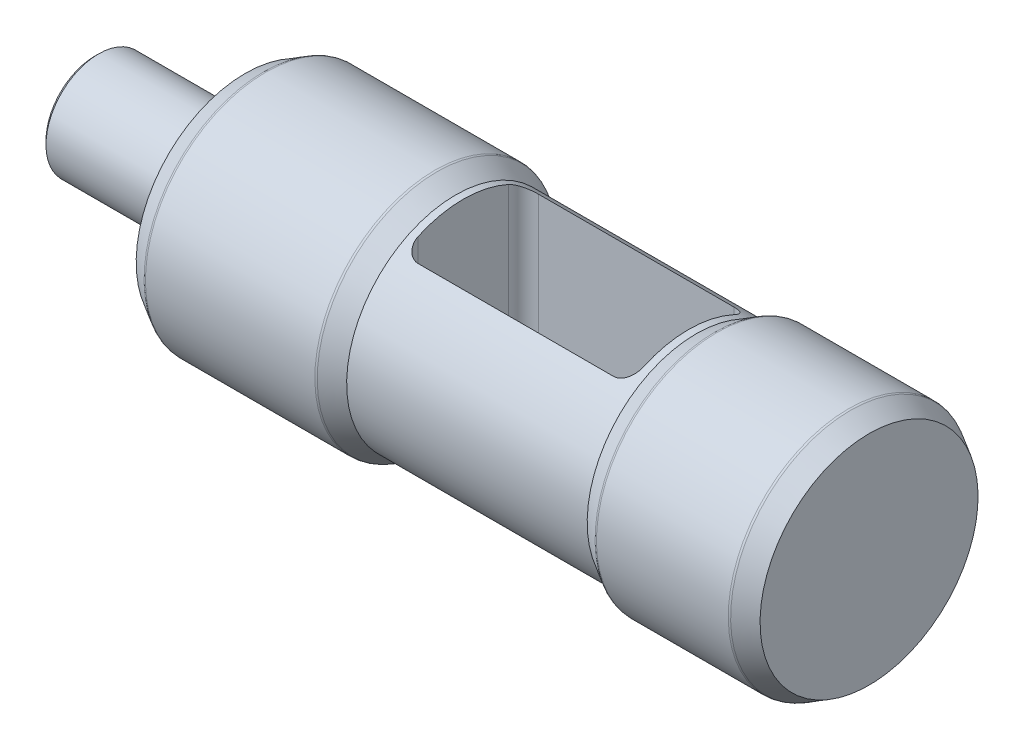
ISO-10303-21;
HEADER;
FILE_DESCRIPTION(('STEP AP214'),'2;1');
FILE_NAME('part.step','',(''),(''),'','','');
FILE_SCHEMA(('AUTOMOTIVE_DESIGN { 1 0 10303 214 1 1 1 1 }'));
ENDSEC;
DATA;
#1=APPLICATION_CONTEXT('core data for automotive mechanical design processes');
#2=APPLICATION_PROTOCOL_DEFINITION('international standard','automotive_design',2000,#1);
#3=PRODUCT_CONTEXT('',#1,'mechanical');
#4=PRODUCT('Part','Part','',(#3));
#5=PRODUCT_RELATED_PRODUCT_CATEGORY('part','',(#4));
#6=PRODUCT_DEFINITION_FORMATION('','',#4);
#7=PRODUCT_DEFINITION_CONTEXT('part definition',#1,'design');
#8=PRODUCT_DEFINITION('design','',#6,#7);
#9=PRODUCT_DEFINITION_SHAPE('','',#8);
#10=(LENGTH_UNIT() NAMED_UNIT(*) SI_UNIT(.MILLI.,.METRE.));
#11=(NAMED_UNIT(*) PLANE_ANGLE_UNIT() SI_UNIT($,.RADIAN.));
#12=(NAMED_UNIT(*) SI_UNIT($,.STERADIAN.) SOLID_ANGLE_UNIT());
#13=UNCERTAINTY_MEASURE_WITH_UNIT(LENGTH_MEASURE(1.E-05),#10,'distance_accuracy_value','');
#14=(GEOMETRIC_REPRESENTATION_CONTEXT(3) GLOBAL_UNCERTAINTY_ASSIGNED_CONTEXT((#13)) GLOBAL_UNIT_ASSIGNED_CONTEXT((#10,
#11,#12)) REPRESENTATION_CONTEXT('',''));
#15=CARTESIAN_POINT('',(0.,0.,0.));
#16=DIRECTION('',(0.,0.,1.));
#17=DIRECTION('',(1.,0.,0.));
#18=AXIS2_PLACEMENT_3D('',#15,#16,#17);
#19=CARTESIAN_POINT('',(0.,0.,0.));
#20=DIRECTION('',(1.,0.,0.));
#21=DIRECTION('',(0.,1.,0.));
#22=AXIS2_PLACEMENT_3D('',#19,#20,#21);
#23=PLANE('',#22);
#24=CARTESIAN_POINT('',(0.,0.,0.));
#25=DIRECTION('',(1.,0.,0.));
#26=DIRECTION('',(0.,1.,0.));
#27=AXIS2_PLACEMENT_3D('',#24,#25,#26);
#28=CIRCLE('',#27,14.5);
#29=CARTESIAN_POINT('',(0.,14.5,0.));
#30=VERTEX_POINT('',#29);
#31=EDGE_CURVE('E110',#30,#30,#28,.T.);
#32=ORIENTED_EDGE('',*,*,#31,.T.);
#33=EDGE_LOOP('',(#32));
#34=FACE_BOUND('',#33,.T.);
#35=ADVANCED_FACE('F38',(#34),#23,.T.);
#36=CARTESIAN_POINT('',(0.,0.,0.));
#37=DIRECTION('',(-1.,0.,0.));
#38=DIRECTION('',(0.,-1.,0.));
#39=AXIS2_PLACEMENT_3D('',#36,#37,#38);
#40=CONICAL_SURFACE('',#39,14.5,0.5235987755983);
#41=CARTESIAN_POINT('',(-2.48205080756886,0.,0.));
#42=DIRECTION('',(1.,0.,0.));
#43=DIRECTION('',(0.,1.,0.));
#44=AXIS2_PLACEMENT_3D('',#41,#42,#43);
#45=CIRCLE('',#44,15.9330127018922);
#46=CARTESIAN_POINT('',(-2.48205080756886,15.9330127018922,0.));
#47=VERTEX_POINT('',#46);
#48=EDGE_CURVE('E221',#47,#47,#45,.T.);
#49=ORIENTED_EDGE('',*,*,#48,.T.);
#50=EDGE_LOOP('',(#49));
#51=FACE_BOUND('',#50,.T.);
#52=ORIENTED_EDGE('',*,*,#31,.F.);
#53=EDGE_LOOP('',(#52));
#54=FACE_BOUND('',#53,.T.);
#55=ADVANCED_FACE('F211',(#51,#54),#40,.T.);
#56=CARTESIAN_POINT('',(-2.73205080756886,0.,0.));
#57=DIRECTION('',(1.,0.,0.));
#58=DIRECTION('',(0.,1.,0.));
#59=AXIS2_PLACEMENT_3D('',#56,#57,#58);
#60=TOROIDAL_SURFACE('',#59,15.5,0.5);
#61=CARTESIAN_POINT('',(-2.73205080756886,0.,0.));
#62=DIRECTION('',(1.,0.,0.));
#63=DIRECTION('',(0.,1.,0.));
#64=AXIS2_PLACEMENT_3D('',#61,#62,#63);
#65=CIRCLE('',#64,16.);
#66=CARTESIAN_POINT('',(-2.73205080756886,16.,0.));
#67=VERTEX_POINT('',#66);
#68=EDGE_CURVE('E223',#67,#67,#65,.T.);
#69=ORIENTED_EDGE('',*,*,#68,.T.);
#70=EDGE_LOOP('',(#69));
#71=FACE_BOUND('',#70,.T.);
#72=ORIENTED_EDGE('',*,*,#48,.F.);
#73=EDGE_LOOP('',(#72));
#74=FACE_BOUND('',#73,.T.);
#75=ADVANCED_FACE('F216',(#71,#74),#60,.T.);
#76=CARTESIAN_POINT('',(0.,0.,0.));
#77=DIRECTION('',(1.,0.,0.));
#78=DIRECTION('',(0.,1.,0.));
#79=AXIS2_PLACEMENT_3D('',#76,#77,#78);
#80=CYLINDRICAL_SURFACE('',#79,16.);
#81=CARTESIAN_POINT('',(-20.2679491924311,0.,0.));
#82=DIRECTION('',(1.,0.,0.));
#83=DIRECTION('',(0.,1.,0.));
#84=AXIS2_PLACEMENT_3D('',#81,#82,#83);
#85=CIRCLE('',#84,16.);
#86=CARTESIAN_POINT('',(-20.2679491924311,16.,0.));
#87=VERTEX_POINT('',#86);
#88=EDGE_CURVE('E228',#87,#87,#85,.T.);
#89=ORIENTED_EDGE('',*,*,#88,.T.);
#90=EDGE_LOOP('',(#89));
#91=FACE_BOUND('',#90,.T.);
#92=ORIENTED_EDGE('',*,*,#68,.F.);
#93=EDGE_LOOP('',(#92));
#94=FACE_BOUND('',#93,.T.);
#95=ADVANCED_FACE('F443',(#91,#94),#80,.T.);
#96=CARTESIAN_POINT('',(-20.2679491924311,0.,0.));
#97=DIRECTION('',(1.,0.,0.));
#98=DIRECTION('',(0.,1.,0.));
#99=AXIS2_PLACEMENT_3D('',#96,#97,#98);
#100=TOROIDAL_SURFACE('',#99,15.5,0.500000000000001);
#101=CARTESIAN_POINT('',(-20.5179491924311,0.,0.));
#102=DIRECTION('',(1.,0.,0.));
#103=DIRECTION('',(0.,1.,0.));
#104=AXIS2_PLACEMENT_3D('',#101,#102,#103);
#105=CIRCLE('',#104,15.9330127018922);
#106=CARTESIAN_POINT('',(-20.5179491924311,15.9330127018922,0.));
#107=VERTEX_POINT('',#106);
#108=EDGE_CURVE('E231',#107,#107,#105,.T.);
#109=ORIENTED_EDGE('',*,*,#108,.T.);
#110=EDGE_LOOP('',(#109));
#111=FACE_BOUND('',#110,.T.);
#112=ORIENTED_EDGE('',*,*,#88,.F.);
#113=EDGE_LOOP('',(#112));
#114=FACE_BOUND('',#113,.T.);
#115=ADVANCED_FACE('F435',(#111,#114),#100,.T.);
#116=CARTESIAN_POINT('',(-20.5179491924311,0.,0.));
#117=DIRECTION('',(1.,0.,0.));
#118=DIRECTION('',(0.,1.,0.));
#119=AXIS2_PLACEMENT_3D('',#116,#117,#118);
#120=CONICAL_SURFACE('',#119,15.9330127018922,0.523598775598302);
#121=CARTESIAN_POINT('',(-23.,0.,0.));
#122=DIRECTION('',(1.,0.,0.));
#123=DIRECTION('',(0.,1.,0.));
#124=AXIS2_PLACEMENT_3D('',#121,#122,#123);
#125=CIRCLE('',#124,14.5);
#126=CARTESIAN_POINT('',(-23.,14.5,0.));
#127=VERTEX_POINT('',#126);
#128=EDGE_CURVE('E234',#127,#127,#125,.T.);
#129=ORIENTED_EDGE('',*,*,#128,.T.);
#130=EDGE_LOOP('',(#129));
#131=FACE_BOUND('',#130,.T.);
#132=ORIENTED_EDGE('',*,*,#108,.F.);
#133=EDGE_LOOP('',(#132));
#134=FACE_BOUND('',#133,.T.);
#135=ADVANCED_FACE('F429',(#131,#134),#120,.T.);
#136=CARTESIAN_POINT('',(0.,0.,0.));
#137=DIRECTION('',(1.,0.,0.));
#138=DIRECTION('',(0.,1.,0.));
#139=AXIS2_PLACEMENT_3D('',#136,#137,#138);
#140=CYLINDRICAL_SURFACE('',#139,14.5);
#141=CARTESIAN_POINT('',(-54.,-13.2003787824441,-5.99999999999999));
#142=CARTESIAN_POINT('',(-53.9999962018204,-13.1718690497998,-6.06272982179049));
#143=CARTESIAN_POINT('',(-53.9970479102192,-13.142923474746,-6.12521694248615));
#144=CARTESIAN_POINT('',(-53.9853787268924,-13.0843682319811,-6.24932020988054));
#145=CARTESIAN_POINT('',(-53.9766590541952,-13.0547587057851,-6.31093653770132));
#146=CARTESIAN_POINT('',(-53.9420315265456,-12.9652683061369,-6.49385660622234));
#147=CARTESIAN_POINT('',(-53.9076548315793,-12.9046856621707,-6.61331913443249));
#148=CARTESIAN_POINT('',(-53.8174613132875,-12.7838925232096,-6.84390757771409));
#149=CARTESIAN_POINT('',(-53.7616525929328,-12.7236818962946,-6.95503662453213));
#150=CARTESIAN_POINT('',(-53.629572397776,-12.6059651757635,-7.16618779818155));
#151=CARTESIAN_POINT('',(-53.5532909196575,-12.5484604204666,-7.26620446145423));
#152=CARTESIAN_POINT('',(-53.3822461974614,-12.4396771379762,-7.4508938332366));
#153=CARTESIAN_POINT('',(-53.2876716094292,-12.3883430632501,-7.5357074466829));
#154=CARTESIAN_POINT('',(-53.081214344984,-12.2947928401368,-7.68739348291283));
#155=CARTESIAN_POINT('',(-52.9693641445728,-12.252559932362,-7.7542989387417));
#156=CARTESIAN_POINT('',(-52.7634649072883,-12.1907097352283,-7.85104865878145));
#157=CARTESIAN_POINT('',(-52.6727096404612,-12.1680648347409,-7.88602074835405));
#158=CARTESIAN_POINT('',(-52.4855767241566,-12.1312070891522,-7.94260470994349));
#159=CARTESIAN_POINT('',(-52.3892115624562,-12.1169762473417,-7.96424510113034));
#160=CARTESIAN_POINT('',(-52.2433217336691,-12.102809159477,-7.98574197090867));
#161=CARTESIAN_POINT('',(-52.1948798830837,-12.0992837574165,-7.9910800331155));
#162=CARTESIAN_POINT('',(-52.0976343705149,-12.0945708851097,-7.99821005557988));
#163=CARTESIAN_POINT('',(-52.0488307917392,-12.0933828929796,-8.00000280741475));
#164=CARTESIAN_POINT('',(-52.,-12.0933866224478,-8.));
#165=B_SPLINE_CURVE_WITH_KNOTS('',3,(#141,#142,#143,#144,#145,#146,#147,#148,#149,#150,#151,
#152,#153,#154,#155,#156,#157,#158,#159,#160,#161,#162,#163,#164),.UNSPECIFIED.,.F.,.F.,(4,2,2,
2,2,2,2,2,2,2,2,4),(0.,0.206572813845276,0.413102009394413,0.825874975162324,1.23849203407839,
1.65131107249231,2.0600801724595,2.46808998575935,2.76645413034276,3.06417777766503,
3.21060297753782,3.35699548070823),.UNSPECIFIED.);
#166=CARTESIAN_POINT('',(-54.,-13.2003787824441,-5.99999999999999));
#167=VERTEX_POINT('',#166);
#168=CARTESIAN_POINT('',(-52.,-12.0933866224478,-8.));
#169=VERTEX_POINT('',#168);
#170=EDGE_CURVE('E11',#167,#169,#165,.T.);
#171=ORIENTED_EDGE('',*,*,#170,.F.);
#172=CARTESIAN_POINT('',(-54.,0.,0.));
#173=DIRECTION('',(-1.,0.,0.));
#174=DIRECTION('',(0.,0.,1.));
#175=AXIS2_PLACEMENT_3D('',#172,#173,#174);
#176=CIRCLE('',#175,14.5);
#177=CARTESIAN_POINT('',(-54.,-13.2003787824441,5.99999999999999));
#178=VERTEX_POINT('',#177);
#179=EDGE_CURVE('E112',#178,#167,#176,.F.);
#180=ORIENTED_EDGE('',*,*,#179,.F.);
#181=CARTESIAN_POINT('',(-52.,-12.0933866224478,8.));
#182=CARTESIAN_POINT('',(-52.0501328052735,-12.0933776880823,8.00000957600883));
#183=CARTESIAN_POINT('',(-52.1002589200244,-12.0946333131581,7.9981153229367));
#184=CARTESIAN_POINT('',(-52.2000829597053,-12.0996057417331,7.99059308530951));
#185=CARTESIAN_POINT('',(-52.2497810860355,-12.1033213153915,7.98496696648209));
#186=CARTESIAN_POINT('',(-52.3481090721925,-12.1131183125209,7.97009654958254));
#187=CARTESIAN_POINT('',(-52.396743356241,-12.1191863685354,7.96087269307811));
#188=CARTESIAN_POINT('',(-52.4928729126603,-12.1335614661929,7.93894562252112));
#189=CARTESIAN_POINT('',(-52.5403680923875,-12.14186868928,7.92624212650517));
#190=CARTESIAN_POINT('',(-52.6805063279257,-12.169897488175,7.88319574438101));
#191=CARTESIAN_POINT('',(-52.7710568912971,-12.1927526897363,7.8478773935867));
#192=CARTESIAN_POINT('',(-52.9445221688712,-12.2453565447377,7.76554045809219));
#193=CARTESIAN_POINT('',(-53.0274268336699,-12.275114094792,7.71850676736153));
#194=CARTESIAN_POINT('',(-53.1901025060887,-12.3423609056927,7.61054876246997));
#195=CARTESIAN_POINT('',(-53.2691939250455,-12.3802579944522,7.5488569415412));
#196=CARTESIAN_POINT('',(-53.4161403846064,-12.4604366082477,7.41576439289835));
#197=CARTESIAN_POINT('',(-53.4839913489786,-12.5027197148272,7.34436016010052));
#198=CARTESIAN_POINT('',(-53.6175087204539,-12.59696271259,7.18168954090559));
#199=CARTESIAN_POINT('',(-53.6811826804918,-12.6494031149878,7.08906239698574));
#200=CARTESIAN_POINT('',(-53.7919043541106,-12.7560648636545,6.89529303359034));
#201=CARTESIAN_POINT('',(-53.8389439190489,-12.8102870685953,6.79414667078557));
#202=CARTESIAN_POINT('',(-53.9175898698882,-12.9216043721237,6.58007459168697));
#203=CARTESIAN_POINT('',(-53.9482833389689,-12.9787044984349,6.46681096196));
#204=CARTESIAN_POINT('',(-53.97918560982,-13.0630501463674,6.29371688567636));
#205=CARTESIAN_POINT('',(-53.9869634399935,-13.0909564136923,6.23546714305457));
#206=CARTESIAN_POINT('',(-53.9973693490221,-13.1461641741954,6.11821665000863));
#207=CARTESIAN_POINT('',(-53.9999966957702,-13.1734655808514,6.05921579401821));
#208=CARTESIAN_POINT('',(-54.,-13.2003787824441,5.99999999999999));
#209=B_SPLINE_CURVE_WITH_KNOTS('',3,(#181,#182,#183,#184,#185,#186,#187,#188,#189,#190,#191,
#192,#193,#194,#195,#196,#197,#198,#199,#200,#201,#202,#203,#204,#205,#206,#207,#208),
.UNSPECIFIED.,.F.,.F.,(4,2,2,2,2,2,2,2,2,2,2,2,2,4),(0.,0.150335895730353,0.300596688372729,
0.450015884698434,0.599447192397797,0.89754210739345,1.19602340086841,1.51647019754078,
1.83703294767077,2.20760945825579,2.57836725141614,2.96809734555003,3.16308370039876,
3.35809776924836),.UNSPECIFIED.);
#210=CARTESIAN_POINT('',(-52.,-12.0933866224478,8.));
#211=VERTEX_POINT('',#210);
#212=EDGE_CURVE('E118',#211,#178,#209,.T.);
#213=ORIENTED_EDGE('',*,*,#212,.F.);
#214=DIRECTION('',(1.,0.,0.));
#215=VECTOR('',#214,1.);
#216=CARTESIAN_POINT('',(0.,-12.0933866224478,8.));
#217=LINE('',#216,#215);
#218=CARTESIAN_POINT('',(-26.,-12.0933866224478,8.));
#219=VERTEX_POINT('',#218);
#220=EDGE_CURVE('E154',#219,#211,#217,.F.);
#221=ORIENTED_EDGE('',*,*,#220,.F.);
#222=CARTESIAN_POINT('',(-24.,-13.2003787824441,5.99999999999999));
#223=CARTESIAN_POINT('',(-24.0000037981796,-13.1718690497998,6.06272982179049));
#224=CARTESIAN_POINT('',(-24.0029520897808,-13.142923474746,6.12521694248615));
#225=CARTESIAN_POINT('',(-24.0146212731076,-13.0843682319811,6.24932020988054));
#226=CARTESIAN_POINT('',(-24.0233409458047,-13.0547587057851,6.31093653770132));
#227=CARTESIAN_POINT('',(-24.0579684734544,-12.9652683061369,6.49385660622234));
#228=CARTESIAN_POINT('',(-24.0923451684207,-12.9046856621707,6.61331913443249));
#229=CARTESIAN_POINT('',(-24.1825386867125,-12.7838925232096,6.84390757771409));
#230=CARTESIAN_POINT('',(-24.2383474070672,-12.7236818962946,6.95503662453213));
#231=CARTESIAN_POINT('',(-24.370427602224,-12.6059651757635,7.16618779818155));
#232=CARTESIAN_POINT('',(-24.4467090803425,-12.5484604204666,7.26620446145423));
#233=CARTESIAN_POINT('',(-24.6177538025385,-12.4396771379762,7.4508938332366));
#234=CARTESIAN_POINT('',(-24.7123283905708,-12.3883430632501,7.5357074466829));
#235=CARTESIAN_POINT('',(-24.918785655016,-12.2947928401368,7.68739348291283));
#236=CARTESIAN_POINT('',(-25.0306358554271,-12.252559932362,7.7542989387417));
#237=CARTESIAN_POINT('',(-25.2365350927117,-12.1907097352283,7.85104865878145));
#238=CARTESIAN_POINT('',(-25.3272903595388,-12.1680648347409,7.88602074835405));
#239=CARTESIAN_POINT('',(-25.5144232758434,-12.1312070891522,7.94260470994348));
#240=CARTESIAN_POINT('',(-25.6107884375438,-12.1169762473417,7.96424510113034));
#241=CARTESIAN_POINT('',(-25.7566782663309,-12.102809159477,7.98574197090867));
#242=CARTESIAN_POINT('',(-25.8051201169163,-12.0992837574165,7.9910800331155));
#243=CARTESIAN_POINT('',(-25.9023656294851,-12.0945708851097,7.99821005557988));
#244=CARTESIAN_POINT('',(-25.9511692082608,-12.0933828929796,8.00000280741475));
#245=CARTESIAN_POINT('',(-26.,-12.0933866224478,8.));
#246=B_SPLINE_CURVE_WITH_KNOTS('',3,(#222,#223,#224,#225,#226,#227,#228,#229,#230,#231,#232,
#233,#234,#235,#236,#237,#238,#239,#240,#241,#242,#243,#244,#245),.UNSPECIFIED.,.F.,.F.,(4,2,2,
2,2,2,2,2,2,2,2,4),(0.,0.206572813845276,0.413102009394414,0.825874975162323,1.23849203407839,
1.65131107249231,2.0600801724595,2.46808998575935,2.76645413034276,3.06417777766502,
3.21060297753781,3.35699548070823),.UNSPECIFIED.);
#247=CARTESIAN_POINT('',(-24.,-13.2003787824441,5.99999999999999));
#248=VERTEX_POINT('',#247);
#249=EDGE_CURVE('E162',#248,#219,#246,.T.);
#250=ORIENTED_EDGE('',*,*,#249,.F.);
#251=CARTESIAN_POINT('',(-24.,0.,0.));
#252=DIRECTION('',(1.,0.,0.));
#253=DIRECTION('',(0.,0.,-1.));
#254=AXIS2_PLACEMENT_3D('',#251,#252,#253);
#255=CIRCLE('',#254,14.5);
#256=CARTESIAN_POINT('',(-24.,-13.2003787824441,-5.99999999999999));
#257=VERTEX_POINT('',#256);
#258=EDGE_CURVE('E168',#257,#248,#255,.F.);
#259=ORIENTED_EDGE('',*,*,#258,.F.);
#260=CARTESIAN_POINT('',(-26.,-12.0933866224478,-8.));
#261=CARTESIAN_POINT('',(-25.9498671947265,-12.0933776880823,-8.00000957600883));
#262=CARTESIAN_POINT('',(-25.8997410799756,-12.0946333131581,-7.9981153229367));
#263=CARTESIAN_POINT('',(-25.7999170402947,-12.0996057417331,-7.99059308530951));
#264=CARTESIAN_POINT('',(-25.7502189139644,-12.1033213153915,-7.98496696648209));
#265=CARTESIAN_POINT('',(-25.6518909278075,-12.1131183125209,-7.97009654958254));
#266=CARTESIAN_POINT('',(-25.603256643759,-12.1191863685354,-7.96087269307811));
#267=CARTESIAN_POINT('',(-25.5071270873397,-12.1335614661929,-7.93894562252112));
#268=CARTESIAN_POINT('',(-25.4596319076125,-12.14186868928,-7.92624212650517));
#269=CARTESIAN_POINT('',(-25.3194936720743,-12.169897488175,-7.88319574438101));
#270=CARTESIAN_POINT('',(-25.2289431087029,-12.1927526897363,-7.8478773935867));
#271=CARTESIAN_POINT('',(-25.0554778311288,-12.2453565447377,-7.7655404580922));
#272=CARTESIAN_POINT('',(-24.9725731663301,-12.275114094792,-7.71850676736153));
#273=CARTESIAN_POINT('',(-24.8098974939113,-12.3423609056927,-7.61054876246998));
#274=CARTESIAN_POINT('',(-24.7308060749544,-12.3802579944522,-7.5488569415412));
#275=CARTESIAN_POINT('',(-24.5838596153936,-12.4604366082477,-7.41576439289836));
#276=CARTESIAN_POINT('',(-24.5160086510214,-12.5027197148272,-7.34436016010052));
#277=CARTESIAN_POINT('',(-24.3824912795461,-12.59696271259,-7.1816895409056));
#278=CARTESIAN_POINT('',(-24.3188173195081,-12.6494031149878,-7.08906239698574));
#279=CARTESIAN_POINT('',(-24.2080956458894,-12.7560648636545,-6.89529303359035));
#280=CARTESIAN_POINT('',(-24.1610560809511,-12.8102870685953,-6.79414667078558));
#281=CARTESIAN_POINT('',(-24.0824101301117,-12.9216043721237,-6.58007459168698));
#282=CARTESIAN_POINT('',(-24.0517166610311,-12.9787044984349,-6.46681096196001));
#283=CARTESIAN_POINT('',(-24.02081439018,-13.0630501463674,-6.29371688567636));
#284=CARTESIAN_POINT('',(-24.0130365600064,-13.0909564136923,-6.23546714305458));
#285=CARTESIAN_POINT('',(-24.0026306509779,-13.1461641741954,-6.11821665000863));
#286=CARTESIAN_POINT('',(-24.0000033042298,-13.1734655808514,-6.05921579401822));
#287=CARTESIAN_POINT('',(-24.,-13.2003787824441,-5.99999999999999));
#288=B_SPLINE_CURVE_WITH_KNOTS('',3,(#260,#261,#262,#263,#264,#265,#266,#267,#268,#269,#270,
#271,#272,#273,#274,#275,#276,#277,#278,#279,#280,#281,#282,#283,#284,#285,#286,#287),
.UNSPECIFIED.,.F.,.F.,(4,2,2,2,2,2,2,2,2,2,2,2,2,4),(0.,0.150335895730339,0.300596688372722,
0.450015884698427,0.599447192397793,0.897542107393438,1.1960234008684,1.51647019754078,
1.83703294767076,2.20760945825579,2.57836725141613,2.96809734555003,3.16308370039876,
3.35809776924836),.UNSPECIFIED.);
#289=CARTESIAN_POINT('',(-26.,-12.0933866224478,-8.));
#290=VERTEX_POINT('',#289);
#291=EDGE_CURVE('E169',#290,#257,#288,.T.);
#292=ORIENTED_EDGE('',*,*,#291,.F.);
#293=DIRECTION('',(1.,0.,0.));
#294=VECTOR('',#293,1.);
#295=CARTESIAN_POINT('',(0.,-12.0933866224478,-8.));
#296=LINE('',#295,#294);
#297=EDGE_CURVE('E51',#169,#290,#296,.T.);
#298=ORIENTED_EDGE('',*,*,#297,.F.);
#299=EDGE_LOOP('',(#171,#180,#213,#221,#250,#259,#292,#298));
#300=FACE_BOUND('',#299,.T.);
#301=CARTESIAN_POINT('',(-52.,12.0933866224478,-8.));
#302=CARTESIAN_POINT('',(-52.0501328052735,12.0933776880823,-8.00000957600883));
#303=CARTESIAN_POINT('',(-52.1002589200244,12.0946333131581,-7.9981153229367));
#304=CARTESIAN_POINT('',(-52.2000829597053,12.0996057417331,-7.99059308530951));
#305=CARTESIAN_POINT('',(-52.2497810860355,12.1033213153915,-7.98496696648209));
#306=CARTESIAN_POINT('',(-52.3481090721925,12.1131183125209,-7.97009654958254));
#307=CARTESIAN_POINT('',(-52.396743356241,12.1191863685354,-7.96087269307811));
#308=CARTESIAN_POINT('',(-52.4928729126603,12.1335614661929,-7.93894562252112));
#309=CARTESIAN_POINT('',(-52.5403680923875,12.14186868928,-7.92624212650517));
#310=CARTESIAN_POINT('',(-52.6805063279257,12.169897488175,-7.88319574438101));
#311=CARTESIAN_POINT('',(-52.7710568912971,12.1927526897363,-7.8478773935867));
#312=CARTESIAN_POINT('',(-52.9445221688712,12.2453565447377,-7.76554045809219));
#313=CARTESIAN_POINT('',(-53.0274268336699,12.2751140947919,-7.71850676736153));
#314=CARTESIAN_POINT('',(-53.1901025060887,12.3423609056927,-7.61054876246997));
#315=CARTESIAN_POINT('',(-53.2691939250455,12.3802579944521,-7.5488569415412));
#316=CARTESIAN_POINT('',(-53.4161403846064,12.4604366082477,-7.41576439289835));
#317=CARTESIAN_POINT('',(-53.4839913489786,12.5027197148272,-7.34436016010052));
#318=CARTESIAN_POINT('',(-53.6175087204539,12.59696271259,-7.18168954090559));
#319=CARTESIAN_POINT('',(-53.6811826804918,12.6494031149878,-7.08906239698574));
#320=CARTESIAN_POINT('',(-53.7919043541106,12.7560648636545,-6.89529303359034));
#321=CARTESIAN_POINT('',(-53.8389439190489,12.8102870685953,-6.79414667078557));
#322=CARTESIAN_POINT('',(-53.9175898698882,12.9216043721237,-6.58007459168697));
#323=CARTESIAN_POINT('',(-53.9482833389689,12.9787044984348,-6.46681096196));
#324=CARTESIAN_POINT('',(-53.97918560982,13.0630501463674,-6.29371688567636));
#325=CARTESIAN_POINT('',(-53.9869634399935,13.0909564136923,-6.23546714305458));
#326=CARTESIAN_POINT('',(-53.9973693490221,13.1461641741954,-6.11821665000863));
#327=CARTESIAN_POINT('',(-53.9999966957702,13.1734655808514,-6.05921579401822));
#328=CARTESIAN_POINT('',(-54.,13.2003787824441,-5.99999999999999));
#329=B_SPLINE_CURVE_WITH_KNOTS('',3,(#301,#302,#303,#304,#305,#306,#307,#308,#309,#310,#311,
#312,#313,#314,#315,#316,#317,#318,#319,#320,#321,#322,#323,#324,#325,#326,#327,#328),
.UNSPECIFIED.,.F.,.F.,(4,2,2,2,2,2,2,2,2,2,2,2,2,4),(0.,0.150335895730353,0.300596688372729,
0.450015884698434,0.599447192397797,0.89754210739345,1.19602340086841,1.51647019754078,
1.83703294767077,2.2076094582558,2.57836725141614,2.96809734555003,3.16308370039876,
3.35809776924836),.UNSPECIFIED.);
#330=CARTESIAN_POINT('',(-52.,12.0933866224478,-8.));
#331=VERTEX_POINT('',#330);
#332=CARTESIAN_POINT('',(-54.,13.2003787824441,-5.99999999999999));
#333=VERTEX_POINT('',#332);
#334=EDGE_CURVE('E155',#331,#333,#329,.T.);
#335=ORIENTED_EDGE('',*,*,#334,.F.);
#336=DIRECTION('',(1.,0.,0.));
#337=VECTOR('',#336,1.);
#338=CARTESIAN_POINT('',(0.,12.0933866224478,-8.));
#339=LINE('',#338,#337);
#340=CARTESIAN_POINT('',(-26.,12.0933866224478,-8.));
#341=VERTEX_POINT('',#340);
#342=EDGE_CURVE('E194',#341,#331,#339,.F.);
#343=ORIENTED_EDGE('',*,*,#342,.F.);
#344=CARTESIAN_POINT('',(-24.,13.2003787824441,-5.99999999999999));
#345=CARTESIAN_POINT('',(-24.0000037981796,13.1718690497998,-6.06272982179049));
#346=CARTESIAN_POINT('',(-24.0029520897808,13.142923474746,-6.12521694248615));
#347=CARTESIAN_POINT('',(-24.0146212731076,13.0843682319811,-6.24932020988054));
#348=CARTESIAN_POINT('',(-24.0233409458047,13.0547587057851,-6.31093653770132));
#349=CARTESIAN_POINT('',(-24.0579684734544,12.9652683061369,-6.49385660622234));
#350=CARTESIAN_POINT('',(-24.0923451684207,12.9046856621707,-6.61331913443249));
#351=CARTESIAN_POINT('',(-24.1825386867125,12.7838925232096,-6.84390757771409));
#352=CARTESIAN_POINT('',(-24.2383474070672,12.7236818962946,-6.95503662453213));
#353=CARTESIAN_POINT('',(-24.370427602224,12.6059651757635,-7.16618779818155));
#354=CARTESIAN_POINT('',(-24.4467090803425,12.5484604204666,-7.26620446145423));
#355=CARTESIAN_POINT('',(-24.6177538025385,12.4396771379762,-7.4508938332366));
#356=CARTESIAN_POINT('',(-24.7123283905708,12.3883430632501,-7.5357074466829));
#357=CARTESIAN_POINT('',(-24.918785655016,12.2947928401368,-7.68739348291283));
#358=CARTESIAN_POINT('',(-25.0306358554271,12.252559932362,-7.7542989387417));
#359=CARTESIAN_POINT('',(-25.2365350927117,12.1907097352282,-7.85104865878145));
#360=CARTESIAN_POINT('',(-25.3272903595388,12.1680648347409,-7.88602074835405));
#361=CARTESIAN_POINT('',(-25.5144232758434,12.1312070891522,-7.94260470994348));
#362=CARTESIAN_POINT('',(-25.6107884375438,12.1169762473417,-7.96424510113034));
#363=CARTESIAN_POINT('',(-25.7566782663309,12.1028091594769,-7.98574197090867));
#364=CARTESIAN_POINT('',(-25.8051201169163,12.0992837574165,-7.9910800331155));
#365=CARTESIAN_POINT('',(-25.9023656294851,12.0945708851097,-7.99821005557988));
#366=CARTESIAN_POINT('',(-25.9511692082608,12.0933828929796,-8.00000280741475));
#367=CARTESIAN_POINT('',(-26.,12.0933866224478,-8.));
#368=B_SPLINE_CURVE_WITH_KNOTS('',3,(#344,#345,#346,#347,#348,#349,#350,#351,#352,#353,#354,
#355,#356,#357,#358,#359,#360,#361,#362,#363,#364,#365,#366,#367),.UNSPECIFIED.,.F.,.F.,(4,2,2,
2,2,2,2,2,2,2,2,4),(0.,0.206572813845276,0.413102009394414,0.825874975162323,1.23849203407839,
1.65131107249231,2.0600801724595,2.46808998575935,2.76645413034276,3.06417777766502,
3.21060297753781,3.35699548070823),.UNSPECIFIED.);
#369=CARTESIAN_POINT('',(-24.,13.2003787824441,-5.99999999999999));
#370=VERTEX_POINT('',#369);
#371=EDGE_CURVE('E189',#370,#341,#368,.T.);
#372=ORIENTED_EDGE('',*,*,#371,.F.);
#373=CARTESIAN_POINT('',(-24.,13.2003787824441,5.99999999999999));
#374=VERTEX_POINT('',#373);
#375=EDGE_CURVE('E187',#374,#370,#255,.F.);
#376=ORIENTED_EDGE('',*,*,#375,.F.);
#377=CARTESIAN_POINT('',(-26.,12.0933866224478,8.));
#378=CARTESIAN_POINT('',(-25.9498671947265,12.0933776880823,8.00000957600883));
#379=CARTESIAN_POINT('',(-25.8997410799756,12.0946333131581,7.9981153229367));
#380=CARTESIAN_POINT('',(-25.7999170402947,12.0996057417331,7.99059308530951));
#381=CARTESIAN_POINT('',(-25.7502189139644,12.1033213153915,7.98496696648209));
#382=CARTESIAN_POINT('',(-25.6518909278075,12.1131183125209,7.97009654958254));
#383=CARTESIAN_POINT('',(-25.603256643759,12.1191863685354,7.96087269307811));
#384=CARTESIAN_POINT('',(-25.5071270873397,12.1335614661929,7.93894562252112));
#385=CARTESIAN_POINT('',(-25.4596319076125,12.14186868928,7.92624212650517));
#386=CARTESIAN_POINT('',(-25.3194936720743,12.169897488175,7.88319574438101));
#387=CARTESIAN_POINT('',(-25.2289431087029,12.1927526897363,7.8478773935867));
#388=CARTESIAN_POINT('',(-25.0554778311288,12.2453565447377,7.7655404580922));
#389=CARTESIAN_POINT('',(-24.9725731663301,12.2751140947919,7.71850676736153));
#390=CARTESIAN_POINT('',(-24.8098974939113,12.3423609056927,7.61054876246998));
#391=CARTESIAN_POINT('',(-24.7308060749544,12.3802579944521,7.5488569415412));
#392=CARTESIAN_POINT('',(-24.5838596153936,12.4604366082477,7.41576439289836));
#393=CARTESIAN_POINT('',(-24.5160086510214,12.5027197148272,7.34436016010052));
#394=CARTESIAN_POINT('',(-24.3824912795461,12.59696271259,7.1816895409056));
#395=CARTESIAN_POINT('',(-24.3188173195081,12.6494031149878,7.08906239698574));
#396=CARTESIAN_POINT('',(-24.2080956458894,12.7560648636545,6.89529303359035));
#397=CARTESIAN_POINT('',(-24.1610560809511,12.8102870685953,6.79414667078558));
#398=CARTESIAN_POINT('',(-24.0824101301117,12.9216043721237,6.58007459168698));
#399=CARTESIAN_POINT('',(-24.0517166610311,12.9787044984348,6.46681096196001));
#400=CARTESIAN_POINT('',(-24.02081439018,13.0630501463674,6.29371688567636));
#401=CARTESIAN_POINT('',(-24.0130365600064,13.0909564136923,6.23546714305458));
#402=CARTESIAN_POINT('',(-24.0026306509779,13.1461641741954,6.11821665000863));
#403=CARTESIAN_POINT('',(-24.0000033042298,13.1734655808514,6.05921579401822));
#404=CARTESIAN_POINT('',(-24.,13.2003787824441,5.99999999999999));
#405=B_SPLINE_CURVE_WITH_KNOTS('',3,(#377,#378,#379,#380,#381,#382,#383,#384,#385,#386,#387,
#388,#389,#390,#391,#392,#393,#394,#395,#396,#397,#398,#399,#400,#401,#402,#403,#404),
.UNSPECIFIED.,.F.,.F.,(4,2,2,2,2,2,2,2,2,2,2,2,2,4),(0.,0.150335895730339,0.300596688372722,
0.450015884698427,0.599447192397793,0.897542107393438,1.1960234008684,1.51647019754078,
1.83703294767076,2.20760945825579,2.57836725141613,2.96809734555003,3.16308370039876,
3.35809776924836),.UNSPECIFIED.);
#406=CARTESIAN_POINT('',(-26.,12.0933866224478,8.));
#407=VERTEX_POINT('',#406);
#408=EDGE_CURVE('E128',#407,#374,#405,.T.);
#409=ORIENTED_EDGE('',*,*,#408,.F.);
#410=DIRECTION('',(1.,0.,0.));
#411=VECTOR('',#410,1.);
#412=CARTESIAN_POINT('',(0.,12.0933866224478,8.));
#413=LINE('',#412,#411);
#414=CARTESIAN_POINT('',(-52.,12.0933866224478,8.));
#415=VERTEX_POINT('',#414);
#416=EDGE_CURVE('E126',#415,#407,#413,.T.);
#417=ORIENTED_EDGE('',*,*,#416,.F.);
#418=CARTESIAN_POINT('',(-54.,13.2003787824441,5.99999999999999));
#419=CARTESIAN_POINT('',(-53.9999962018204,13.1718690497998,6.06272982179049));
#420=CARTESIAN_POINT('',(-53.9970479102192,13.142923474746,6.12521694248615));
#421=CARTESIAN_POINT('',(-53.9853787268924,13.0843682319811,6.24932020988054));
#422=CARTESIAN_POINT('',(-53.9766590541952,13.0547587057851,6.31093653770132));
#423=CARTESIAN_POINT('',(-53.9420315265456,12.9652683061369,6.49385660622234));
#424=CARTESIAN_POINT('',(-53.9076548315793,12.9046856621707,6.61331913443249));
#425=CARTESIAN_POINT('',(-53.8174613132875,12.7838925232096,6.84390757771409));
#426=CARTESIAN_POINT('',(-53.7616525929328,12.7236818962946,6.95503662453213));
#427=CARTESIAN_POINT('',(-53.629572397776,12.6059651757635,7.16618779818155));
#428=CARTESIAN_POINT('',(-53.5532909196575,12.5484604204666,7.26620446145423));
#429=CARTESIAN_POINT('',(-53.3822461974614,12.4396771379762,7.45089383323659));
#430=CARTESIAN_POINT('',(-53.2876716094292,12.3883430632501,7.5357074466829));
#431=CARTESIAN_POINT('',(-53.081214344984,12.2947928401368,7.68739348291283));
#432=CARTESIAN_POINT('',(-52.9693641445728,12.252559932362,7.7542989387417));
#433=CARTESIAN_POINT('',(-52.7634649072883,12.1907097352282,7.85104865878145));
#434=CARTESIAN_POINT('',(-52.6727096404612,12.1680648347409,7.88602074835405));
#435=CARTESIAN_POINT('',(-52.4855767241566,12.1312070891522,7.94260470994348));
#436=CARTESIAN_POINT('',(-52.3892115624562,12.1169762473417,7.96424510113034));
#437=CARTESIAN_POINT('',(-52.2433217336691,12.1028091594769,7.98574197090867));
#438=CARTESIAN_POINT('',(-52.1948798830837,12.0992837574165,7.9910800331155));
#439=CARTESIAN_POINT('',(-52.0976343705149,12.0945708851097,7.99821005557988));
#440=CARTESIAN_POINT('',(-52.0488307917392,12.0933828929796,8.00000280741475));
#441=CARTESIAN_POINT('',(-52.,12.0933866224478,8.));
#442=B_SPLINE_CURVE_WITH_KNOTS('',3,(#418,#419,#420,#421,#422,#423,#424,#425,#426,#427,#428,
#429,#430,#431,#432,#433,#434,#435,#436,#437,#438,#439,#440,#441),.UNSPECIFIED.,.F.,.F.,(4,2,2,
2,2,2,2,2,2,2,2,4),(0.,0.206572813845275,0.413102009394413,0.825874975162324,1.23849203407839,
1.65131107249231,2.0600801724595,2.46808998575935,2.76645413034275,3.06417777766502,
3.21060297753782,3.35699548070823),.UNSPECIFIED.);
#443=CARTESIAN_POINT('',(-54.,13.2003787824441,5.99999999999999));
#444=VERTEX_POINT('',#443);
#445=EDGE_CURVE('E109',#444,#415,#442,.T.);
#446=ORIENTED_EDGE('',*,*,#445,.F.);
#447=EDGE_CURVE('E104',#333,#444,#176,.F.);
#448=ORIENTED_EDGE('',*,*,#447,.F.);
#449=EDGE_LOOP('',(#335,#343,#372,#376,#409,#417,#446,#448));
#450=FACE_BOUND('',#449,.T.);
#451=CARTESIAN_POINT('',(-55.,0.,0.));
#452=DIRECTION('',(1.,0.,0.));
#453=DIRECTION('',(0.,1.,0.));
#454=AXIS2_PLACEMENT_3D('',#451,#452,#453);
#455=CIRCLE('',#454,14.5);
#456=CARTESIAN_POINT('',(-55.,14.5,0.));
#457=VERTEX_POINT('',#456);
#458=EDGE_CURVE('E237',#457,#457,#455,.T.);
#459=ORIENTED_EDGE('',*,*,#458,.T.);
#460=EDGE_LOOP('',(#459));
#461=FACE_BOUND('',#460,.T.);
#462=ORIENTED_EDGE('',*,*,#128,.F.);
#463=EDGE_LOOP('',(#462));
#464=FACE_BOUND('',#463,.T.);
#465=ADVANCED_FACE('F123',(#300,#450,#461,#464),#140,.T.);
#466=CARTESIAN_POINT('',(-55.,0.,0.));
#467=DIRECTION('',(-1.,0.,0.));
#468=DIRECTION('',(0.,-1.,0.));
#469=AXIS2_PLACEMENT_3D('',#466,#467,#468);
#470=CONICAL_SURFACE('',#469,14.5,0.523598775598301);
#471=CARTESIAN_POINT('',(-57.4820508075689,0.,0.));
#472=DIRECTION('',(1.,0.,0.));
#473=DIRECTION('',(0.,1.,0.));
#474=AXIS2_PLACEMENT_3D('',#471,#472,#473);
#475=CIRCLE('',#474,15.9330127018922);
#476=CARTESIAN_POINT('',(-57.4820508075689,15.9330127018922,0.));
#477=VERTEX_POINT('',#476);
#478=EDGE_CURVE('E240',#477,#477,#475,.T.);
#479=ORIENTED_EDGE('',*,*,#478,.T.);
#480=EDGE_LOOP('',(#479));
#481=FACE_BOUND('',#480,.T.);
#482=ORIENTED_EDGE('',*,*,#458,.F.);
#483=EDGE_LOOP('',(#482));
#484=FACE_BOUND('',#483,.T.);
#485=ADVANCED_FACE('F413',(#481,#484),#470,.T.);
#486=CARTESIAN_POINT('',(-57.7320508075689,0.,0.));
#487=DIRECTION('',(1.,0.,0.));
#488=DIRECTION('',(0.,1.,0.));
#489=AXIS2_PLACEMENT_3D('',#486,#487,#488);
#490=TOROIDAL_SURFACE('',#489,15.5,0.500000000000001);
#491=CARTESIAN_POINT('',(-57.7320508075689,0.,0.));
#492=DIRECTION('',(1.,0.,0.));
#493=DIRECTION('',(0.,1.,0.));
#494=AXIS2_PLACEMENT_3D('',#491,#492,#493);
#495=CIRCLE('',#494,16.);
#496=CARTESIAN_POINT('',(-57.7320508075689,16.,0.));
#497=VERTEX_POINT('',#496);
#498=EDGE_CURVE('E243',#497,#497,#495,.T.);
#499=ORIENTED_EDGE('',*,*,#498,.T.);
#500=EDGE_LOOP('',(#499));
#501=FACE_BOUND('',#500,.T.);
#502=ORIENTED_EDGE('',*,*,#478,.F.);
#503=EDGE_LOOP('',(#502));
#504=FACE_BOUND('',#503,.T.);
#505=ADVANCED_FACE('F404',(#501,#504),#490,.T.);
#506=CARTESIAN_POINT('',(0.,0.,0.));
#507=DIRECTION('',(1.,0.,0.));
#508=DIRECTION('',(0.,1.,0.));
#509=AXIS2_PLACEMENT_3D('',#506,#507,#508);
#510=CYLINDRICAL_SURFACE('',#509,16.);
#511=CARTESIAN_POINT('',(-80.2679491924311,0.,0.));
#512=DIRECTION('',(1.,0.,0.));
#513=DIRECTION('',(0.,1.,0.));
#514=AXIS2_PLACEMENT_3D('',#511,#512,#513);
#515=CIRCLE('',#514,16.);
#516=CARTESIAN_POINT('',(-80.2679491924311,16.,0.));
#517=VERTEX_POINT('',#516);
#518=EDGE_CURVE('E246',#517,#517,#515,.T.);
#519=ORIENTED_EDGE('',*,*,#518,.T.);
#520=EDGE_LOOP('',(#519));
#521=FACE_BOUND('',#520,.T.);
#522=ORIENTED_EDGE('',*,*,#498,.F.);
#523=EDGE_LOOP('',(#522));
#524=FACE_BOUND('',#523,.T.);
#525=ADVANCED_FACE('F395',(#521,#524),#510,.T.);
#526=CARTESIAN_POINT('',(-80.2679491924311,0.,0.));
#527=DIRECTION('',(1.,0.,0.));
#528=DIRECTION('',(0.,1.,0.));
#529=AXIS2_PLACEMENT_3D('',#526,#527,#528);
#530=TOROIDAL_SURFACE('',#529,15.5,0.5);
#531=CARTESIAN_POINT('',(-80.5179491924311,0.,0.));
#532=DIRECTION('',(1.,0.,0.));
#533=DIRECTION('',(0.,1.,0.));
#534=AXIS2_PLACEMENT_3D('',#531,#532,#533);
#535=CIRCLE('',#534,15.9330127018922);
#536=CARTESIAN_POINT('',(-80.5179491924311,15.9330127018922,0.));
#537=VERTEX_POINT('',#536);
#538=EDGE_CURVE('E249',#537,#537,#535,.T.);
#539=ORIENTED_EDGE('',*,*,#538,.T.);
#540=EDGE_LOOP('',(#539));
#541=FACE_BOUND('',#540,.T.);
#542=ORIENTED_EDGE('',*,*,#518,.F.);
#543=EDGE_LOOP('',(#542));
#544=FACE_BOUND('',#543,.T.);
#545=ADVANCED_FACE('F386',(#541,#544),#530,.T.);
#546=CARTESIAN_POINT('',(-80.5179491924311,0.,0.));
#547=DIRECTION('',(1.,0.,0.));
#548=DIRECTION('',(0.,1.,0.));
#549=AXIS2_PLACEMENT_3D('',#546,#547,#548);
#550=CONICAL_SURFACE('',#549,15.9330127018922,0.523598775598301);
#551=CARTESIAN_POINT('',(-83.,0.,0.));
#552=DIRECTION('',(1.,0.,0.));
#553=DIRECTION('',(0.,1.,0.));
#554=AXIS2_PLACEMENT_3D('',#551,#552,#553);
#555=CIRCLE('',#554,14.5);
#556=CARTESIAN_POINT('',(-83.,14.5,0.));
#557=VERTEX_POINT('',#556);
#558=EDGE_CURVE('E252',#557,#557,#555,.T.);
#559=ORIENTED_EDGE('',*,*,#558,.T.);
#560=EDGE_LOOP('',(#559));
#561=FACE_BOUND('',#560,.T.);
#562=ORIENTED_EDGE('',*,*,#538,.F.);
#563=EDGE_LOOP('',(#562));
#564=FACE_BOUND('',#563,.T.);
#565=ADVANCED_FACE('F377',(#561,#564),#550,.T.);
#566=CARTESIAN_POINT('',(-83.,14.5,0.));
#567=DIRECTION('',(-1.,0.,0.));
#568=DIRECTION('',(0.,-1.,0.));
#569=AXIS2_PLACEMENT_3D('',#566,#567,#568);
#570=PLANE('',#569);
#571=CARTESIAN_POINT('',(-83.,0.,0.));
#572=DIRECTION('',(1.,0.,0.));
#573=DIRECTION('',(0.,1.,0.));
#574=AXIS2_PLACEMENT_3D('',#571,#572,#573);
#575=CIRCLE('',#574,7.);
#576=CARTESIAN_POINT('',(-83.,6.99999999999999,0.));
#577=VERTEX_POINT('',#576);
#578=EDGE_CURVE('E255',#577,#577,#575,.T.);
#579=ORIENTED_EDGE('',*,*,#578,.T.);
#580=EDGE_LOOP('',(#579));
#581=FACE_BOUND('',#580,.T.);
#582=ORIENTED_EDGE('',*,*,#558,.F.);
#583=EDGE_LOOP('',(#582));
#584=FACE_BOUND('',#583,.T.);
#585=ADVANCED_FACE('F368',(#581,#584),#570,.T.);
#586=CARTESIAN_POINT('',(0.,0.,0.));
#587=DIRECTION('',(1.,0.,0.));
#588=DIRECTION('',(0.,1.,0.));
#589=AXIS2_PLACEMENT_3D('',#586,#587,#588);
#590=CYLINDRICAL_SURFACE('',#589,7.);
#591=CARTESIAN_POINT('',(-102.5,0.,0.));
#592=DIRECTION('',(1.,0.,0.));
#593=DIRECTION('',(0.,1.,0.));
#594=AXIS2_PLACEMENT_3D('',#591,#592,#593);
#595=CIRCLE('',#594,7.);
#596=CARTESIAN_POINT('',(-102.5,6.99999999999999,0.));
#597=VERTEX_POINT('',#596);
#598=EDGE_CURVE('E258',#597,#597,#595,.T.);
#599=ORIENTED_EDGE('',*,*,#598,.T.);
#600=EDGE_LOOP('',(#599));
#601=FACE_BOUND('',#600,.T.);
#602=ORIENTED_EDGE('',*,*,#578,.F.);
#603=EDGE_LOOP('',(#602));
#604=FACE_BOUND('',#603,.T.);
#605=ADVANCED_FACE('F359',(#601,#604),#590,.T.);
#606=CARTESIAN_POINT('',(-102.5,0.,0.));
#607=DIRECTION('',(1.,0.,0.));
#608=DIRECTION('',(0.,1.,0.));
#609=AXIS2_PLACEMENT_3D('',#606,#607,#608);
#610=CONICAL_SURFACE('',#609,7.,0.785398163397447);
#611=CARTESIAN_POINT('',(-103.,0.,0.));
#612=DIRECTION('',(1.,0.,0.));
#613=DIRECTION('',(0.,1.,0.));
#614=AXIS2_PLACEMENT_3D('',#611,#612,#613);
#615=CIRCLE('',#614,6.5);
#616=CARTESIAN_POINT('',(-103.,6.49999999999999,0.));
#617=VERTEX_POINT('',#616);
#618=EDGE_CURVE('E261',#617,#617,#615,.T.);
#619=ORIENTED_EDGE('',*,*,#618,.T.);
#620=EDGE_LOOP('',(#619));
#621=FACE_BOUND('',#620,.T.);
#622=ORIENTED_EDGE('',*,*,#598,.F.);
#623=EDGE_LOOP('',(#622));
#624=FACE_BOUND('',#623,.T.);
#625=ADVANCED_FACE('F350',(#621,#624),#610,.T.);
#626=CARTESIAN_POINT('',(-103.,6.49999999999999,0.));
#627=DIRECTION('',(-1.,0.,0.));
#628=DIRECTION('',(0.,-1.,0.));
#629=AXIS2_PLACEMENT_3D('',#626,#627,#628);
#630=PLANE('',#629);
#631=ORIENTED_EDGE('',*,*,#618,.F.);
#632=EDGE_LOOP('',(#631));
#633=FACE_BOUND('',#632,.T.);
#634=ADVANCED_FACE('F208',(#633),#630,.T.);
#635=CARTESIAN_POINT('',(-52.,-16.,-6.));
#636=DIRECTION('',(0.,1.,0.));
#637=DIRECTION('',(0.,0.,1.));
#638=AXIS2_PLACEMENT_3D('',#635,#636,#637);
#639=CYLINDRICAL_SURFACE('',#638,2.);
#640=ORIENTED_EDGE('',*,*,#170,.T.);
#641=DIRECTION('',(0.,1.,0.));
#642=VECTOR('',#641,1.);
#643=CARTESIAN_POINT('',(-52.,-16.,-8.));
#644=LINE('',#643,#642);
#645=EDGE_CURVE('E264',#169,#331,#644,.T.);
#646=ORIENTED_EDGE('',*,*,#645,.T.);
#647=ORIENTED_EDGE('',*,*,#334,.T.);
#648=DIRECTION('',(0.,1.,0.));
#649=VECTOR('',#648,1.);
#650=CARTESIAN_POINT('',(-54.,-16.,-5.99999999999999));
#651=LINE('',#650,#649);
#652=EDGE_CURVE('E63',#167,#333,#651,.T.);
#653=ORIENTED_EDGE('',*,*,#652,.F.);
#654=EDGE_LOOP('',(#640,#646,#647,#653));
#655=FACE_BOUND('',#654,.T.);
#656=ADVANCED_FACE('F203',(#655),#639,.F.);
#657=CARTESIAN_POINT('',(-52.,-16.,-8.));
#658=DIRECTION('',(0.,0.,-1.));
#659=DIRECTION('',(-1.,0.,0.));
#660=AXIS2_PLACEMENT_3D('',#657,#658,#659);
#661=PLANE('',#660);
#662=ORIENTED_EDGE('',*,*,#342,.T.);
#663=ORIENTED_EDGE('',*,*,#645,.F.);
#664=ORIENTED_EDGE('',*,*,#297,.T.);
#665=DIRECTION('',(0.,1.,0.));
#666=VECTOR('',#665,1.);
#667=CARTESIAN_POINT('',(-26.,-16.,-8.));
#668=LINE('',#667,#666);
#669=EDGE_CURVE('E276',#290,#341,#668,.T.);
#670=ORIENTED_EDGE('',*,*,#669,.T.);
#671=EDGE_LOOP('',(#662,#663,#664,#670));
#672=FACE_BOUND('',#671,.T.);
#673=ADVANCED_FACE('F199',(#672),#661,.F.);
#674=CARTESIAN_POINT('',(-26.,-16.,-6.));
#675=DIRECTION('',(0.,1.,0.));
#676=DIRECTION('',(0.,0.,1.));
#677=AXIS2_PLACEMENT_3D('',#674,#675,#676);
#678=CYLINDRICAL_SURFACE('',#677,2.);
#679=ORIENTED_EDGE('',*,*,#291,.T.);
#680=DIRECTION('',(0.,1.,0.));
#681=VECTOR('',#680,1.);
#682=CARTESIAN_POINT('',(-24.,-16.,-5.99999999999999));
#683=LINE('',#682,#681);
#684=EDGE_CURVE('E273',#257,#370,#683,.T.);
#685=ORIENTED_EDGE('',*,*,#684,.T.);
#686=ORIENTED_EDGE('',*,*,#371,.T.);
#687=ORIENTED_EDGE('',*,*,#669,.F.);
#688=EDGE_LOOP('',(#679,#685,#686,#687));
#689=FACE_BOUND('',#688,.T.);
#690=ADVANCED_FACE('F195',(#689),#678,.F.);
#691=CARTESIAN_POINT('',(-24.,-16.,5.99999999999999));
#692=DIRECTION('',(1.,0.,0.));
#693=DIRECTION('',(0.,0.,-1.));
#694=AXIS2_PLACEMENT_3D('',#691,#692,#693);
#695=PLANE('',#694);
#696=ORIENTED_EDGE('',*,*,#258,.T.);
#697=DIRECTION('',(0.,1.,0.));
#698=VECTOR('',#697,1.);
#699=CARTESIAN_POINT('',(-24.,-16.,5.99999999999999));
#700=LINE('',#699,#698);
#701=EDGE_CURVE('E270',#248,#374,#700,.T.);
#702=ORIENTED_EDGE('',*,*,#701,.T.);
#703=ORIENTED_EDGE('',*,*,#375,.T.);
#704=ORIENTED_EDGE('',*,*,#684,.F.);
#705=EDGE_LOOP('',(#696,#702,#703,#704));
#706=FACE_BOUND('',#705,.T.);
#707=ADVANCED_FACE('F179',(#706),#695,.F.);
#708=CARTESIAN_POINT('',(-26.,-16.,6.));
#709=DIRECTION('',(0.,1.,0.));
#710=DIRECTION('',(0.,0.,1.));
#711=AXIS2_PLACEMENT_3D('',#708,#709,#710);
#712=CYLINDRICAL_SURFACE('',#711,2.);
#713=ORIENTED_EDGE('',*,*,#249,.T.);
#714=DIRECTION('',(0.,1.,0.));
#715=VECTOR('',#714,1.);
#716=CARTESIAN_POINT('',(-26.,-16.,8.));
#717=LINE('',#716,#715);
#718=EDGE_CURVE('E267',#219,#407,#717,.T.);
#719=ORIENTED_EDGE('',*,*,#718,.T.);
#720=ORIENTED_EDGE('',*,*,#408,.T.);
#721=ORIENTED_EDGE('',*,*,#701,.F.);
#722=EDGE_LOOP('',(#713,#719,#720,#721));
#723=FACE_BOUND('',#722,.T.);
#724=ADVANCED_FACE('F175',(#723),#712,.F.);
#725=CARTESIAN_POINT('',(-52.,-16.,8.));
#726=DIRECTION('',(0.,0.,1.));
#727=DIRECTION('',(1.,0.,0.));
#728=AXIS2_PLACEMENT_3D('',#725,#726,#727);
#729=PLANE('',#728);
#730=ORIENTED_EDGE('',*,*,#220,.T.);
#731=DIRECTION('',(0.,1.,0.));
#732=VECTOR('',#731,1.);
#733=CARTESIAN_POINT('',(-52.,-16.,8.));
#734=LINE('',#733,#732);
#735=EDGE_CURVE('E120',#211,#415,#734,.T.);
#736=ORIENTED_EDGE('',*,*,#735,.T.);
#737=ORIENTED_EDGE('',*,*,#416,.T.);
#738=ORIENTED_EDGE('',*,*,#718,.F.);
#739=EDGE_LOOP('',(#730,#736,#737,#738));
#740=FACE_BOUND('',#739,.T.);
#741=ADVANCED_FACE('F144',(#740),#729,.F.);
#742=CARTESIAN_POINT('',(-52.,-16.,6.));
#743=DIRECTION('',(0.,1.,0.));
#744=DIRECTION('',(0.,0.,1.));
#745=AXIS2_PLACEMENT_3D('',#742,#743,#744);
#746=CYLINDRICAL_SURFACE('',#745,2.);
#747=ORIENTED_EDGE('',*,*,#212,.T.);
#748=DIRECTION('',(0.,1.,0.));
#749=VECTOR('',#748,1.);
#750=CARTESIAN_POINT('',(-54.,-16.,5.99999999999999));
#751=LINE('',#750,#749);
#752=EDGE_CURVE('E58',#178,#444,#751,.T.);
#753=ORIENTED_EDGE('',*,*,#752,.T.);
#754=ORIENTED_EDGE('',*,*,#445,.T.);
#755=ORIENTED_EDGE('',*,*,#735,.F.);
#756=EDGE_LOOP('',(#747,#753,#754,#755));
#757=FACE_BOUND('',#756,.T.);
#758=ADVANCED_FACE('F114',(#757),#746,.F.);
#759=CARTESIAN_POINT('',(-54.,-16.,5.99999999999999));
#760=DIRECTION('',(-1.,0.,0.));
#761=DIRECTION('',(0.,0.,1.));
#762=AXIS2_PLACEMENT_3D('',#759,#760,#761);
#763=PLANE('',#762);
#764=ORIENTED_EDGE('',*,*,#179,.T.);
#765=ORIENTED_EDGE('',*,*,#652,.T.);
#766=ORIENTED_EDGE('',*,*,#447,.T.);
#767=ORIENTED_EDGE('',*,*,#752,.F.);
#768=EDGE_LOOP('',(#764,#765,#766,#767));
#769=FACE_BOUND('',#768,.T.);
#770=ADVANCED_FACE('F105',(#769),#763,.F.);
#771=CLOSED_SHELL('',(#35,#55,#75,#95,#115,#135,#465,#485,#505,#525,#545,#565,#585,#605,#625,
#634,#656,#673,#690,#707,#724,#741,#758,#770));
#772=MANIFOLD_SOLID_BREP('B2',#771);
#773=ADVANCED_BREP_SHAPE_REPRESENTATION('',(#18,#772),#14);
#774=SHAPE_DEFINITION_REPRESENTATION(#9,#773);
ENDSEC;
END-ISO-10303-21;
